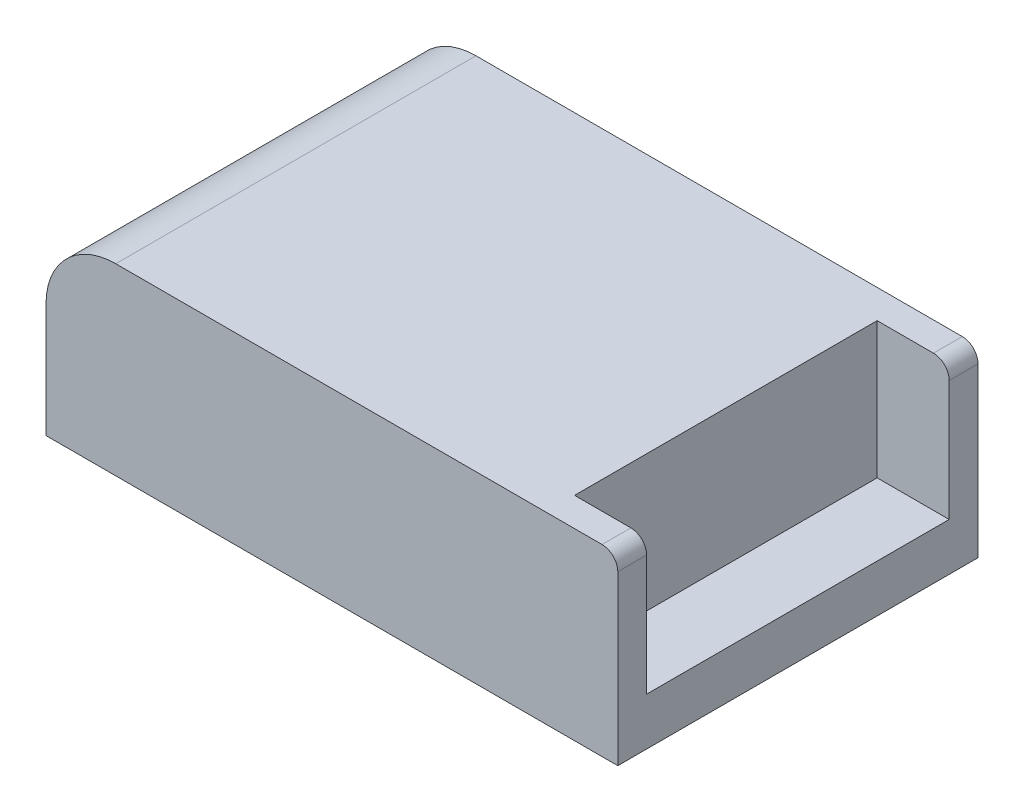
ISO-10303-21;
HEADER;
FILE_DESCRIPTION(('STEP AP214'),'2;1');
FILE_NAME('part.step','',(''),(''),'','','');
FILE_SCHEMA(('AUTOMOTIVE_DESIGN { 1 0 10303 214 1 1 1 1 }'));
ENDSEC;
DATA;
#1=APPLICATION_CONTEXT('core data for automotive mechanical design processes');
#2=APPLICATION_PROTOCOL_DEFINITION('international standard','automotive_design',2000,#1);
#3=PRODUCT_CONTEXT('',#1,'mechanical');
#4=PRODUCT('Part','Part','',(#3));
#5=PRODUCT_RELATED_PRODUCT_CATEGORY('part','',(#4));
#6=PRODUCT_DEFINITION_FORMATION('','',#4);
#7=PRODUCT_DEFINITION_CONTEXT('part definition',#1,'design');
#8=PRODUCT_DEFINITION('design','',#6,#7);
#9=PRODUCT_DEFINITION_SHAPE('','',#8);
#10=(LENGTH_UNIT() NAMED_UNIT(*) SI_UNIT(.MILLI.,.METRE.));
#11=(NAMED_UNIT(*) PLANE_ANGLE_UNIT() SI_UNIT($,.RADIAN.));
#12=(NAMED_UNIT(*) SI_UNIT($,.STERADIAN.) SOLID_ANGLE_UNIT());
#13=UNCERTAINTY_MEASURE_WITH_UNIT(LENGTH_MEASURE(1.E-05),#10,'distance_accuracy_value','');
#14=(GEOMETRIC_REPRESENTATION_CONTEXT(3) GLOBAL_UNCERTAINTY_ASSIGNED_CONTEXT((#13)) GLOBAL_UNIT_ASSIGNED_CONTEXT((#10,
#11,#12)) REPRESENTATION_CONTEXT('',''));
#15=CARTESIAN_POINT('',(0.,0.,0.));
#16=DIRECTION('',(0.,0.,1.));
#17=DIRECTION('',(1.,0.,0.));
#18=AXIS2_PLACEMENT_3D('',#15,#16,#17);
#19=CARTESIAN_POINT('',(-92.7788825792047,-11.811695588401,-84.6873783128646));
#20=DIRECTION('',(0.,0.,1.));
#21=DIRECTION('',(1.,0.,0.));
#22=AXIS2_PLACEMENT_3D('',#19,#20,#21);
#23=CYLINDRICAL_SURFACE('',#22,1.3875);
#24=CARTESIAN_POINT('',(-92.7788825792047,-11.811695588401,-2.54));
#25=DIRECTION('',(0.,0.,1.));
#26=DIRECTION('',(1.,0.,0.));
#27=AXIS2_PLACEMENT_3D('',#24,#25,#26);
#28=CIRCLE('',#27,1.3875);
#29=CARTESIAN_POINT('',(-92.7788825792047,-10.424195588401,-2.54));
#30=VERTEX_POINT('',#29);
#31=CARTESIAN_POINT('',(-91.3913825792047,-11.811695588401,-2.54));
#32=VERTEX_POINT('',#31);
#33=EDGE_CURVE('E165',#30,#32,#28,.F.);
#34=ORIENTED_EDGE('',*,*,#33,.F.);
#35=DIRECTION('',(0.,0.,1.));
#36=VECTOR('',#35,1.);
#37=CARTESIAN_POINT('',(-92.7788825792047,-10.424195588401,-84.6873783128646));
#38=LINE('',#37,#36);
#39=CARTESIAN_POINT('',(-92.7788825792047,-10.424195588401,0.));
#40=VERTEX_POINT('',#39);
#41=EDGE_CURVE('E216',#30,#40,#38,.T.);
#42=ORIENTED_EDGE('',*,*,#41,.T.);
#43=CARTESIAN_POINT('',(-92.7788825792047,-11.811695588401,0.));
#44=DIRECTION('',(0.,0.,1.));
#45=DIRECTION('',(1.,0.,0.));
#46=AXIS2_PLACEMENT_3D('',#43,#44,#45);
#47=CIRCLE('',#46,1.3875);
#48=CARTESIAN_POINT('',(-91.3913825792047,-11.811695588401,0.));
#49=VERTEX_POINT('',#48);
#50=EDGE_CURVE('E195',#49,#40,#47,.T.);
#51=ORIENTED_EDGE('',*,*,#50,.F.);
#52=DIRECTION('',(0.,0.,1.));
#53=VECTOR('',#52,1.);
#54=CARTESIAN_POINT('',(-91.3913825792047,-11.811695588401,-84.6873783128646));
#55=LINE('',#54,#53);
#56=EDGE_CURVE('E219',#32,#49,#55,.T.);
#57=ORIENTED_EDGE('',*,*,#56,.F.);
#58=EDGE_LOOP('',(#34,#42,#51,#57));
#59=FACE_BOUND('',#58,.T.);
#60=ADVANCED_FACE('F41',(#59),#23,.T.);
#61=CARTESIAN_POINT('',(-141.791382579205,-26.6169724546259,-84.6873783128646));
#62=DIRECTION('',(-1.,0.,0.));
#63=DIRECTION('',(0.,0.,1.));
#64=AXIS2_PLACEMENT_3D('',#61,#62,#63);
#65=PLANE('',#64);
#66=DIRECTION('',(0.,1.,0.));
#67=VECTOR('',#66,1.);
#68=CARTESIAN_POINT('',(-141.791382579205,-26.6169724546259,-31.75));
#69=LINE('',#68,#67);
#70=CARTESIAN_POINT('',(-141.791382579205,-26.6169724546259,-31.75));
#71=VERTEX_POINT('',#70);
#72=CARTESIAN_POINT('',(-141.791382579205,-16.574195588401,-31.75));
#73=VERTEX_POINT('',#72);
#74=EDGE_CURVE('E50',#71,#73,#69,.T.);
#75=ORIENTED_EDGE('',*,*,#74,.F.);
#76=DIRECTION('',(0.,0.,1.));
#77=VECTOR('',#76,1.);
#78=CARTESIAN_POINT('',(-141.791382579205,-26.6169724546259,-84.6873783128646));
#79=LINE('',#78,#77);
#80=CARTESIAN_POINT('',(-141.791382579205,-26.6169724546259,0.));
#81=VERTEX_POINT('',#80);
#82=EDGE_CURVE('E207',#71,#81,#79,.T.);
#83=ORIENTED_EDGE('',*,*,#82,.T.);
#84=DIRECTION('',(0.,-1.,0.));
#85=VECTOR('',#84,1.);
#86=CARTESIAN_POINT('',(-141.791382579205,-26.6169724546259,0.));
#87=LINE('',#86,#85);
#88=CARTESIAN_POINT('',(-141.791382579205,-16.574195588401,0.));
#89=VERTEX_POINT('',#88);
#90=EDGE_CURVE('E169',#89,#81,#87,.T.);
#91=ORIENTED_EDGE('',*,*,#90,.F.);
#92=DIRECTION('',(0.,0.,1.));
#93=VECTOR('',#92,1.);
#94=CARTESIAN_POINT('',(-141.791382579205,-16.574195588401,-84.6873783128646));
#95=LINE('',#94,#93);
#96=EDGE_CURVE('E173',#73,#89,#95,.T.);
#97=ORIENTED_EDGE('',*,*,#96,.F.);
#98=EDGE_LOOP('',(#75,#83,#91,#97));
#99=FACE_BOUND('',#98,.T.);
#100=ADVANCED_FACE('F43',(#99),#65,.T.);
#101=CARTESIAN_POINT('',(-135.641382579205,-16.574195588401,-84.6873783128646));
#102=DIRECTION('',(0.,0.,1.));
#103=DIRECTION('',(1.,0.,0.));
#104=AXIS2_PLACEMENT_3D('',#101,#102,#103);
#105=CYLINDRICAL_SURFACE('',#104,6.14999999999999);
#106=CARTESIAN_POINT('',(-135.641382579205,-16.574195588401,-31.75));
#107=DIRECTION('',(0.,0.,1.));
#108=DIRECTION('',(1.,0.,0.));
#109=AXIS2_PLACEMENT_3D('',#106,#107,#108);
#110=CIRCLE('',#109,6.14999999999999);
#111=CARTESIAN_POINT('',(-135.641382579205,-10.424195588401,-31.75));
#112=VERTEX_POINT('',#111);
#113=EDGE_CURVE('E179',#73,#112,#110,.F.);
#114=ORIENTED_EDGE('',*,*,#113,.F.);
#115=ORIENTED_EDGE('',*,*,#96,.T.);
#116=CARTESIAN_POINT('',(-135.641382579205,-16.574195588401,0.));
#117=DIRECTION('',(0.,0.,1.));
#118=DIRECTION('',(1.,0.,0.));
#119=AXIS2_PLACEMENT_3D('',#116,#117,#118);
#120=CIRCLE('',#119,6.14999999999999);
#121=CARTESIAN_POINT('',(-135.641382579205,-10.424195588401,0.));
#122=VERTEX_POINT('',#121);
#123=EDGE_CURVE('E203',#122,#89,#120,.T.);
#124=ORIENTED_EDGE('',*,*,#123,.F.);
#125=DIRECTION('',(0.,0.,1.));
#126=VECTOR('',#125,1.);
#127=CARTESIAN_POINT('',(-135.641382579205,-10.424195588401,-84.6873783128646));
#128=LINE('',#127,#126);
#129=EDGE_CURVE('E209',#112,#122,#128,.T.);
#130=ORIENTED_EDGE('',*,*,#129,.F.);
#131=EDGE_LOOP('',(#114,#115,#124,#130));
#132=FACE_BOUND('',#131,.T.);
#133=ADVANCED_FACE('F238',(#132),#105,.T.);
#134=CARTESIAN_POINT('',(-92.7788825792047,-10.424195588401,-84.6873783128646));
#135=DIRECTION('',(0.,1.,0.));
#136=DIRECTION('',(0.,0.,1.));
#137=AXIS2_PLACEMENT_3D('',#134,#135,#136);
#138=PLANE('',#137);
#139=DIRECTION('',(1.,0.,0.));
#140=VECTOR('',#139,1.);
#141=CARTESIAN_POINT('',(-97.7413825792047,-10.424195588401,-2.54));
#142=LINE('',#141,#140);
#143=CARTESIAN_POINT('',(-97.7413825792047,-10.424195588401,-2.54));
#144=VERTEX_POINT('',#143);
#145=EDGE_CURVE('E145',#144,#30,#142,.T.);
#146=ORIENTED_EDGE('',*,*,#145,.F.);
#147=DIRECTION('',(0.,0.,1.));
#148=VECTOR('',#147,1.);
#149=CARTESIAN_POINT('',(-97.7413825792047,-10.424195588401,-29.21));
#150=LINE('',#149,#148);
#151=CARTESIAN_POINT('',(-97.7413825792047,-10.424195588401,-29.21));
#152=VERTEX_POINT('',#151);
#153=EDGE_CURVE('E251',#152,#144,#150,.T.);
#154=ORIENTED_EDGE('',*,*,#153,.F.);
#155=DIRECTION('',(-1.,0.,0.));
#156=VECTOR('',#155,1.);
#157=CARTESIAN_POINT('',(-97.7413825792047,-10.424195588401,-29.21));
#158=LINE('',#157,#156);
#159=CARTESIAN_POINT('',(-92.7788825792047,-10.424195588401,-29.21));
#160=VERTEX_POINT('',#159);
#161=EDGE_CURVE('E247',#160,#152,#158,.T.);
#162=ORIENTED_EDGE('',*,*,#161,.F.);
#163=CARTESIAN_POINT('',(-92.7788825792047,-10.424195588401,-31.75));
#164=VERTEX_POINT('',#163);
#165=EDGE_CURVE('E212',#164,#160,#38,.T.);
#166=ORIENTED_EDGE('',*,*,#165,.F.);
#167=DIRECTION('',(1.,0.,0.));
#168=VECTOR('',#167,1.);
#169=CARTESIAN_POINT('',(-92.7788825792047,-10.424195588401,-31.75));
#170=LINE('',#169,#168);
#171=EDGE_CURVE('E176',#112,#164,#170,.T.);
#172=ORIENTED_EDGE('',*,*,#171,.F.);
#173=ORIENTED_EDGE('',*,*,#129,.T.);
#174=DIRECTION('',(-1.,0.,0.));
#175=VECTOR('',#174,1.);
#176=CARTESIAN_POINT('',(-92.7788825792047,-10.424195588401,0.));
#177=LINE('',#176,#175);
#178=EDGE_CURVE('E199',#40,#122,#177,.T.);
#179=ORIENTED_EDGE('',*,*,#178,.F.);
#180=ORIENTED_EDGE('',*,*,#41,.F.);
#181=EDGE_LOOP('',(#146,#154,#162,#166,#172,#173,#179,#180));
#182=FACE_BOUND('',#181,.T.);
#183=ADVANCED_FACE('F244',(#182),#138,.T.);
#184=CARTESIAN_POINT('',(-92.7788825792047,-11.811695588401,-29.21));
#185=DIRECTION('',(0.,0.,-1.));
#186=DIRECTION('',(-1.,0.,0.));
#187=AXIS2_PLACEMENT_3D('',#184,#185,#186);
#188=CIRCLE('',#187,1.3875);
#189=CARTESIAN_POINT('',(-91.3913825792047,-11.811695588401,-29.21));
#190=VERTEX_POINT('',#189);
#191=EDGE_CURVE('E162',#190,#160,#188,.F.);
#192=ORIENTED_EDGE('',*,*,#191,.F.);
#193=CARTESIAN_POINT('',(-91.3913825792047,-11.811695588401,-31.75));
#194=VERTEX_POINT('',#193);
#195=EDGE_CURVE('E150',#194,#190,#55,.T.);
#196=ORIENTED_EDGE('',*,*,#195,.F.);
#197=CARTESIAN_POINT('',(-92.7788825792047,-11.811695588401,-31.75));
#198=DIRECTION('',(0.,0.,1.));
#199=DIRECTION('',(1.,0.,0.));
#200=AXIS2_PLACEMENT_3D('',#197,#198,#199);
#201=CIRCLE('',#200,1.3875);
#202=EDGE_CURVE('E66',#164,#194,#201,.F.);
#203=ORIENTED_EDGE('',*,*,#202,.F.);
#204=ORIENTED_EDGE('',*,*,#165,.T.);
#205=EDGE_LOOP('',(#192,#196,#203,#204));
#206=FACE_BOUND('',#205,.T.);
#207=ADVANCED_FACE('F249',(#206),#23,.T.);
#208=CARTESIAN_POINT('',(-91.3913825792047,-26.6169724546259,-84.6873783128646));
#209=DIRECTION('',(1.,0.,0.));
#210=DIRECTION('',(0.,0.,-1.));
#211=AXIS2_PLACEMENT_3D('',#208,#209,#210);
#212=PLANE('',#211);
#213=DIRECTION('',(0.,1.,0.));
#214=VECTOR('',#213,1.);
#215=CARTESIAN_POINT('',(-91.3913825792047,-22.424195588401,-2.54));
#216=LINE('',#215,#214);
#217=CARTESIAN_POINT('',(-91.3913825792047,-22.424195588401,-2.54));
#218=VERTEX_POINT('',#217);
#219=EDGE_CURVE('E166',#218,#32,#216,.T.);
#220=ORIENTED_EDGE('',*,*,#219,.T.);
#221=ORIENTED_EDGE('',*,*,#56,.T.);
#222=DIRECTION('',(0.,1.,0.));
#223=VECTOR('',#222,1.);
#224=CARTESIAN_POINT('',(-91.3913825792047,-26.6169724546259,0.));
#225=LINE('',#224,#223);
#226=CARTESIAN_POINT('',(-91.3913825792047,-26.6169724546259,0.));
#227=VERTEX_POINT('',#226);
#228=EDGE_CURVE('E191',#227,#49,#225,.T.);
#229=ORIENTED_EDGE('',*,*,#228,.F.);
#230=DIRECTION('',(0.,0.,1.));
#231=VECTOR('',#230,1.);
#232=CARTESIAN_POINT('',(-91.3913825792047,-26.6169724546259,-84.6873783128646));
#233=LINE('',#232,#231);
#234=CARTESIAN_POINT('',(-91.3913825792047,-26.6169724546259,-31.75));
#235=VERTEX_POINT('',#234);
#236=EDGE_CURVE('E220',#235,#227,#233,.T.);
#237=ORIENTED_EDGE('',*,*,#236,.F.);
#238=DIRECTION('',(0.,-1.,0.));
#239=VECTOR('',#238,1.);
#240=CARTESIAN_POINT('',(-91.3913825792047,-26.6169724546259,-31.75));
#241=LINE('',#240,#239);
#242=EDGE_CURVE('E170',#194,#235,#241,.T.);
#243=ORIENTED_EDGE('',*,*,#242,.F.);
#244=ORIENTED_EDGE('',*,*,#195,.T.);
#245=DIRECTION('',(0.,1.,0.));
#246=VECTOR('',#245,1.);
#247=CARTESIAN_POINT('',(-91.3913825792047,-22.424195588401,-29.21));
#248=LINE('',#247,#246);
#249=CARTESIAN_POINT('',(-91.3913825792047,-22.424195588401,-29.21));
#250=VERTEX_POINT('',#249);
#251=EDGE_CURVE('E131',#250,#190,#248,.T.);
#252=ORIENTED_EDGE('',*,*,#251,.F.);
#253=DIRECTION('',(0.,0.,-1.));
#254=VECTOR('',#253,1.);
#255=CARTESIAN_POINT('',(-91.3913825792047,-22.424195588401,-29.21));
#256=LINE('',#255,#254);
#257=EDGE_CURVE('E138',#218,#250,#256,.T.);
#258=ORIENTED_EDGE('',*,*,#257,.F.);
#259=EDGE_LOOP('',(#220,#221,#229,#237,#243,#244,#252,#258));
#260=FACE_BOUND('',#259,.T.);
#261=ADVANCED_FACE('F148',(#260),#212,.T.);
#262=CARTESIAN_POINT('',(-91.3913825792047,-26.6169724546259,-84.6873783128646));
#263=DIRECTION('',(0.,-1.,0.));
#264=DIRECTION('',(0.,0.,-1.));
#265=AXIS2_PLACEMENT_3D('',#262,#263,#264);
#266=PLANE('',#265);
#267=DIRECTION('',(-1.,0.,0.));
#268=VECTOR('',#267,1.);
#269=CARTESIAN_POINT('',(-91.3913825792047,-26.6169724546259,-31.75));
#270=LINE('',#269,#268);
#271=EDGE_CURVE('E11',#235,#71,#270,.T.);
#272=ORIENTED_EDGE('',*,*,#271,.F.);
#273=ORIENTED_EDGE('',*,*,#236,.T.);
#274=DIRECTION('',(1.,0.,0.));
#275=VECTOR('',#274,1.);
#276=CARTESIAN_POINT('',(-91.3913825792047,-26.6169724546259,0.));
#277=LINE('',#276,#275);
#278=EDGE_CURVE('E187',#81,#227,#277,.T.);
#279=ORIENTED_EDGE('',*,*,#278,.F.);
#280=ORIENTED_EDGE('',*,*,#82,.F.);
#281=EDGE_LOOP('',(#272,#273,#279,#280));
#282=FACE_BOUND('',#281,.T.);
#283=ADVANCED_FACE('F229',(#282),#266,.T.);
#284=CARTESIAN_POINT('',(-135.641382579205,-16.574195588401,0.));
#285=DIRECTION('',(0.,0.,1.));
#286=DIRECTION('',(1.,0.,0.));
#287=AXIS2_PLACEMENT_3D('',#284,#285,#286);
#288=PLANE('',#287);
#289=ORIENTED_EDGE('',*,*,#90,.T.);
#290=ORIENTED_EDGE('',*,*,#278,.T.);
#291=ORIENTED_EDGE('',*,*,#228,.T.);
#292=ORIENTED_EDGE('',*,*,#50,.T.);
#293=ORIENTED_EDGE('',*,*,#178,.T.);
#294=ORIENTED_EDGE('',*,*,#123,.T.);
#295=EDGE_LOOP('',(#289,#290,#291,#292,#293,#294));
#296=FACE_BOUND('',#295,.T.);
#297=ADVANCED_FACE('F233',(#296),#288,.T.);
#298=CARTESIAN_POINT('',(0.,0.,-31.75));
#299=DIRECTION('',(0.,0.,1.));
#300=DIRECTION('',(0.,-1.,0.));
#301=AXIS2_PLACEMENT_3D('',#298,#299,#300);
#302=PLANE('',#301);
#303=ORIENTED_EDGE('',*,*,#74,.T.);
#304=ORIENTED_EDGE('',*,*,#113,.T.);
#305=ORIENTED_EDGE('',*,*,#171,.T.);
#306=ORIENTED_EDGE('',*,*,#202,.T.);
#307=ORIENTED_EDGE('',*,*,#242,.T.);
#308=ORIENTED_EDGE('',*,*,#271,.T.);
#309=EDGE_LOOP('',(#303,#304,#305,#306,#307,#308));
#310=FACE_BOUND('',#309,.T.);
#311=ADVANCED_FACE('F240',(#310),#302,.F.);
#312=CARTESIAN_POINT('',(-97.7413825792047,-22.424195588401,-2.54));
#313=DIRECTION('',(0.,0.,1.));
#314=DIRECTION('',(1.,0.,0.));
#315=AXIS2_PLACEMENT_3D('',#312,#313,#314);
#316=PLANE('',#315);
#317=ORIENTED_EDGE('',*,*,#33,.T.);
#318=ORIENTED_EDGE('',*,*,#219,.F.);
#319=DIRECTION('',(1.,0.,0.));
#320=VECTOR('',#319,1.);
#321=CARTESIAN_POINT('',(-97.7413825792047,-22.424195588401,-2.54));
#322=LINE('',#321,#320);
#323=CARTESIAN_POINT('',(-97.7413825792047,-22.424195588401,-2.54));
#324=VERTEX_POINT('',#323);
#325=EDGE_CURVE('E57',#324,#218,#322,.T.);
#326=ORIENTED_EDGE('',*,*,#325,.F.);
#327=DIRECTION('',(0.,1.,0.));
#328=VECTOR('',#327,1.);
#329=CARTESIAN_POINT('',(-97.7413825792047,-22.424195588401,-2.54));
#330=LINE('',#329,#328);
#331=EDGE_CURVE('E156',#324,#144,#330,.T.);
#332=ORIENTED_EDGE('',*,*,#331,.T.);
#333=ORIENTED_EDGE('',*,*,#145,.T.);
#334=EDGE_LOOP('',(#317,#318,#326,#332,#333));
#335=FACE_BOUND('',#334,.T.);
#336=ADVANCED_FACE('F265',(#335),#316,.F.);
#337=CARTESIAN_POINT('',(-97.7413825792047,-22.424195588401,-29.21));
#338=DIRECTION('',(-1.,0.,0.));
#339=DIRECTION('',(0.,0.,1.));
#340=AXIS2_PLACEMENT_3D('',#337,#338,#339);
#341=PLANE('',#340);
#342=ORIENTED_EDGE('',*,*,#153,.T.);
#343=ORIENTED_EDGE('',*,*,#331,.F.);
#344=DIRECTION('',(0.,0.,1.));
#345=VECTOR('',#344,1.);
#346=CARTESIAN_POINT('',(-97.7413825792047,-22.424195588401,-29.21));
#347=LINE('',#346,#345);
#348=CARTESIAN_POINT('',(-97.7413825792047,-22.424195588401,-29.21));
#349=VERTEX_POINT('',#348);
#350=EDGE_CURVE('E137',#349,#324,#347,.T.);
#351=ORIENTED_EDGE('',*,*,#350,.F.);
#352=DIRECTION('',(0.,1.,0.));
#353=VECTOR('',#352,1.);
#354=CARTESIAN_POINT('',(-97.7413825792047,-22.424195588401,-29.21));
#355=LINE('',#354,#353);
#356=EDGE_CURVE('E134',#349,#152,#355,.T.);
#357=ORIENTED_EDGE('',*,*,#356,.T.);
#358=EDGE_LOOP('',(#342,#343,#351,#357));
#359=FACE_BOUND('',#358,.T.);
#360=ADVANCED_FACE('F255',(#359),#341,.F.);
#361=CARTESIAN_POINT('',(-97.7413825792047,-22.424195588401,-29.21));
#362=DIRECTION('',(0.,0.,-1.));
#363=DIRECTION('',(-1.,0.,0.));
#364=AXIS2_PLACEMENT_3D('',#361,#362,#363);
#365=PLANE('',#364);
#366=ORIENTED_EDGE('',*,*,#191,.T.);
#367=ORIENTED_EDGE('',*,*,#161,.T.);
#368=ORIENTED_EDGE('',*,*,#356,.F.);
#369=DIRECTION('',(-1.,0.,0.));
#370=VECTOR('',#369,1.);
#371=CARTESIAN_POINT('',(-97.7413825792047,-22.424195588401,-29.21));
#372=LINE('',#371,#370);
#373=EDGE_CURVE('E128',#250,#349,#372,.T.);
#374=ORIENTED_EDGE('',*,*,#373,.F.);
#375=ORIENTED_EDGE('',*,*,#251,.T.);
#376=EDGE_LOOP('',(#366,#367,#368,#374,#375));
#377=FACE_BOUND('',#376,.T.);
#378=ADVANCED_FACE('F129',(#377),#365,.F.);
#379=CARTESIAN_POINT('',(0.,-22.424195588401,0.));
#380=DIRECTION('',(0.,1.,0.));
#381=DIRECTION('',(0.,0.,1.));
#382=AXIS2_PLACEMENT_3D('',#379,#380,#381);
#383=PLANE('',#382);
#384=ORIENTED_EDGE('',*,*,#257,.T.);
#385=ORIENTED_EDGE('',*,*,#373,.T.);
#386=ORIENTED_EDGE('',*,*,#350,.T.);
#387=ORIENTED_EDGE('',*,*,#325,.T.);
#388=EDGE_LOOP('',(#384,#385,#386,#387));
#389=FACE_BOUND('',#388,.T.);
#390=ADVANCED_FACE('F141',(#389),#383,.T.);
#391=CLOSED_SHELL('',(#60,#100,#133,#183,#207,#261,#283,#297,#311,#336,#360,#378,#390));
#392=MANIFOLD_SOLID_BREP('B2',#391);
#393=ADVANCED_BREP_SHAPE_REPRESENTATION('',(#18,#392),#14);
#394=SHAPE_DEFINITION_REPRESENTATION(#9,#393);
ENDSEC;
END-ISO-10303-21;
